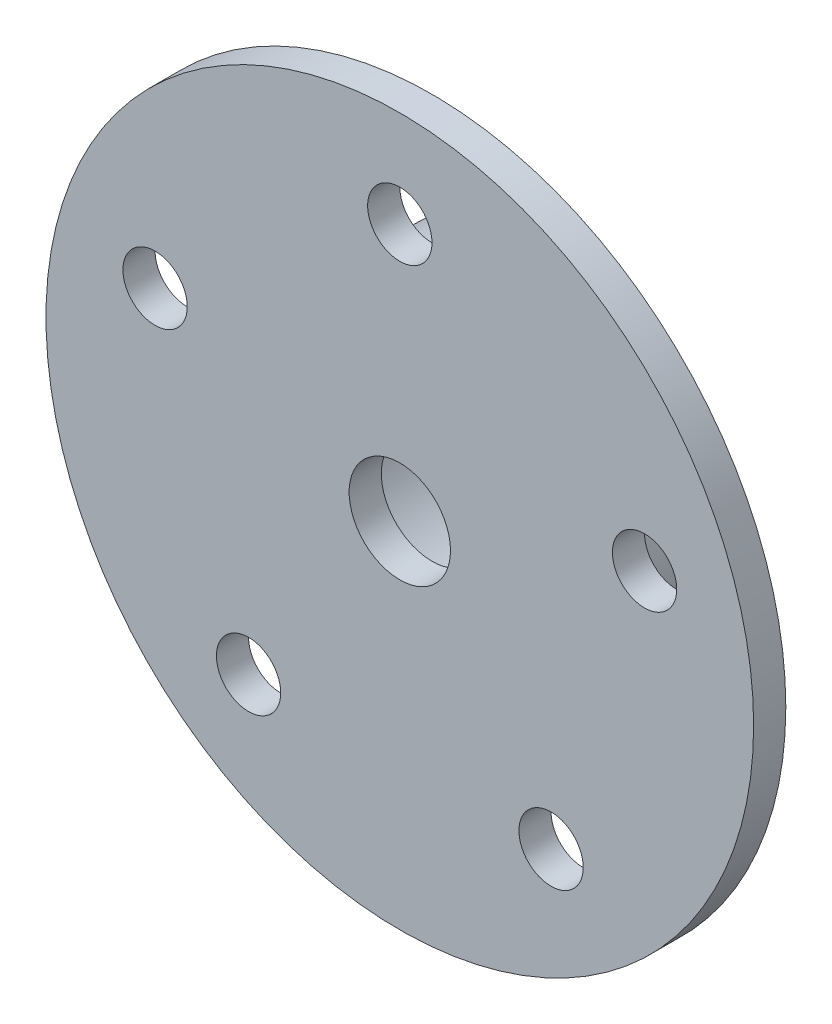
ISO-10303-21;
HEADER;
FILE_DESCRIPTION(('STEP AP214'),'2;1');
FILE_NAME('part.step','',(''),(''),'','','');
FILE_SCHEMA(('AUTOMOTIVE_DESIGN { 1 0 10303 214 1 1 1 1 }'));
ENDSEC;
DATA;
#1=APPLICATION_CONTEXT('core data for automotive mechanical design processes');
#2=APPLICATION_PROTOCOL_DEFINITION('international standard','automotive_design',2000,#1);
#3=PRODUCT_CONTEXT('',#1,'mechanical');
#4=PRODUCT('Part','Part','',(#3));
#5=PRODUCT_RELATED_PRODUCT_CATEGORY('part','',(#4));
#6=PRODUCT_DEFINITION_FORMATION('','',#4);
#7=PRODUCT_DEFINITION_CONTEXT('part definition',#1,'design');
#8=PRODUCT_DEFINITION('design','',#6,#7);
#9=PRODUCT_DEFINITION_SHAPE('','',#8);
#10=(LENGTH_UNIT() NAMED_UNIT(*) SI_UNIT(.MILLI.,.METRE.));
#11=(NAMED_UNIT(*) PLANE_ANGLE_UNIT() SI_UNIT($,.RADIAN.));
#12=(NAMED_UNIT(*) SI_UNIT($,.STERADIAN.) SOLID_ANGLE_UNIT());
#13=UNCERTAINTY_MEASURE_WITH_UNIT(LENGTH_MEASURE(1.E-05),#10,'distance_accuracy_value','');
#14=(GEOMETRIC_REPRESENTATION_CONTEXT(3) GLOBAL_UNCERTAINTY_ASSIGNED_CONTEXT((#13)) GLOBAL_UNIT_ASSIGNED_CONTEXT((#10,
#11,#12)) REPRESENTATION_CONTEXT('',''));
#15=CARTESIAN_POINT('',(0.,0.,0.));
#16=DIRECTION('',(0.,0.,1.));
#17=DIRECTION('',(1.,0.,0.));
#18=AXIS2_PLACEMENT_3D('',#15,#16,#17);
#19=CARTESIAN_POINT('',(0.,0.,0.));
#20=DIRECTION('',(0.,0.,1.));
#21=DIRECTION('',(1.,0.,0.));
#22=AXIS2_PLACEMENT_3D('',#19,#20,#21);
#23=PLANE('',#22);
#24=CARTESIAN_POINT('',(0.,0.,0.));
#25=DIRECTION('',(0.,0.,1.));
#26=DIRECTION('',(1.,0.,0.));
#27=AXIS2_PLACEMENT_3D('',#24,#25,#26);
#28=CIRCLE('',#27,3.15);
#29=CARTESIAN_POINT('',(3.15,0.,0.));
#30=VERTEX_POINT('',#29);
#31=EDGE_CURVE('E63',#30,#30,#28,.T.);
#32=ORIENTED_EDGE('',*,*,#31,.T.);
#33=EDGE_LOOP('',(#32));
#34=FACE_BOUND('',#33,.T.);
#35=CARTESIAN_POINT('',(0.,0.,0.));
#36=DIRECTION('',(0.,0.,-1.));
#37=DIRECTION('',(-1.,0.,0.));
#38=AXIS2_PLACEMENT_3D('',#35,#36,#37);
#39=CIRCLE('',#38,7.6);
#40=CARTESIAN_POINT('',(-7.6,0.,0.));
#41=VERTEX_POINT('',#40);
#42=EDGE_CURVE('E90',#41,#41,#39,.T.);
#43=ORIENTED_EDGE('',*,*,#42,.T.);
#44=EDGE_LOOP('',(#43));
#45=FACE_BOUND('',#44,.T.);
#46=ADVANCED_FACE('F33',(#34,#45),#23,.F.);
#47=CARTESIAN_POINT('',(0.,0.,2.));
#48=DIRECTION('',(0.,0.,1.));
#49=DIRECTION('',(1.,0.,0.));
#50=AXIS2_PLACEMENT_3D('',#47,#48,#49);
#51=PLANE('',#50);
#52=CARTESIAN_POINT('',(-9.40456403667834,-12.9442719099996,2.));
#53=DIRECTION('',(0.,0.,1.));
#54=DIRECTION('',(1.,0.,0.));
#55=AXIS2_PLACEMENT_3D('',#52,#53,#54);
#56=CIRCLE('',#55,2.00000000000142);
#57=CARTESIAN_POINT('',(-7.40456403667692,-12.9442719099996,2.));
#58=VERTEX_POINT('',#57);
#59=EDGE_CURVE('E72',#58,#58,#56,.T.);
#60=ORIENTED_EDGE('',*,*,#59,.F.);
#61=EDGE_LOOP('',(#60));
#62=FACE_BOUND('',#61,.T.);
#63=CARTESIAN_POINT('',(0.,0.,2.));
#64=DIRECTION('',(0.,0.,1.));
#65=DIRECTION('',(1.,0.,0.));
#66=AXIS2_PLACEMENT_3D('',#63,#64,#65);
#67=CIRCLE('',#66,3.15);
#68=CARTESIAN_POINT('',(3.15,0.,2.));
#69=VERTEX_POINT('',#68);
#70=EDGE_CURVE('E60',#69,#69,#67,.T.);
#71=ORIENTED_EDGE('',*,*,#70,.F.);
#72=EDGE_LOOP('',(#71));
#73=FACE_BOUND('',#72,.T.);
#74=CARTESIAN_POINT('',(0.,16.,2.));
#75=DIRECTION('',(0.,0.,1.));
#76=DIRECTION('',(1.,0.,0.));
#77=AXIS2_PLACEMENT_3D('',#74,#75,#76);
#78=CIRCLE('',#77,2.);
#79=CARTESIAN_POINT('',(2.,16.,2.));
#80=VERTEX_POINT('',#79);
#81=EDGE_CURVE('E49',#80,#80,#78,.T.);
#82=ORIENTED_EDGE('',*,*,#81,.F.);
#83=EDGE_LOOP('',(#82));
#84=FACE_BOUND('',#83,.T.);
#85=CARTESIAN_POINT('',(0.,0.,2.));
#86=DIRECTION('',(0.,0.,1.));
#87=DIRECTION('',(1.,0.,0.));
#88=AXIS2_PLACEMENT_3D('',#85,#86,#87);
#89=CIRCLE('',#88,22.);
#90=CARTESIAN_POINT('',(22.,0.,2.));
#91=VERTEX_POINT('',#90);
#92=EDGE_CURVE('E40',#91,#91,#89,.T.);
#93=ORIENTED_EDGE('',*,*,#92,.T.);
#94=EDGE_LOOP('',(#93));
#95=FACE_BOUND('',#94,.T.);
#96=CARTESIAN_POINT('',(15.2169042607229,4.94427190999981,2.));
#97=DIRECTION('',(0.,0.,1.));
#98=DIRECTION('',(1.,0.,0.));
#99=AXIS2_PLACEMENT_3D('',#96,#97,#98);
#100=CIRCLE('',#99,2.00000000000031);
#101=CARTESIAN_POINT('',(17.2169042607232,4.94427190999981,2.));
#102=VERTEX_POINT('',#101);
#103=EDGE_CURVE('E54',#102,#102,#100,.T.);
#104=ORIENTED_EDGE('',*,*,#103,.F.);
#105=EDGE_LOOP('',(#104));
#106=FACE_BOUND('',#105,.T.);
#107=CARTESIAN_POINT('',(9.4045640366808,-12.9442719099988,2.));
#108=DIRECTION('',(0.,0.,1.));
#109=DIRECTION('',(1.,0.,0.));
#110=AXIS2_PLACEMENT_3D('',#107,#108,#109);
#111=CIRCLE('',#110,2.00000000000115);
#112=CARTESIAN_POINT('',(11.4045640366819,-12.9442719099988,2.));
#113=VERTEX_POINT('',#112);
#114=EDGE_CURVE('E66',#113,#113,#111,.T.);
#115=ORIENTED_EDGE('',*,*,#114,.F.);
#116=EDGE_LOOP('',(#115));
#117=FACE_BOUND('',#116,.T.);
#118=CARTESIAN_POINT('',(-15.216904260722,4.94427190999851,2.));
#119=DIRECTION('',(0.,0.,1.));
#120=DIRECTION('',(1.,0.,0.));
#121=AXIS2_PLACEMENT_3D('',#118,#119,#120);
#122=CIRCLE('',#121,2.00000000000081);
#123=CARTESIAN_POINT('',(-13.2169042607212,4.94427190999851,2.));
#124=VERTEX_POINT('',#123);
#125=EDGE_CURVE('E78',#124,#124,#122,.T.);
#126=ORIENTED_EDGE('',*,*,#125,.F.);
#127=EDGE_LOOP('',(#126));
#128=FACE_BOUND('',#127,.T.);
#129=ADVANCED_FACE('F116',(#62,#73,#84,#95,#106,#117,#128),#51,.T.);
#130=CARTESIAN_POINT('',(0.,0.,0.));
#131=DIRECTION('',(0.,0.,1.));
#132=DIRECTION('',(1.,0.,0.));
#133=AXIS2_PLACEMENT_3D('',#130,#131,#132);
#134=CIRCLE('',#133,11.);
#135=CARTESIAN_POINT('',(11.,0.,0.));
#136=VERTEX_POINT('',#135);
#137=EDGE_CURVE('E10',#136,#136,#134,.F.);
#138=ORIENTED_EDGE('',*,*,#137,.F.);
#139=EDGE_LOOP('',(#138));
#140=FACE_BOUND('',#139,.T.);
#141=CARTESIAN_POINT('',(0.,0.,0.));
#142=DIRECTION('',(0.,0.,1.));
#143=DIRECTION('',(1.,0.,0.));
#144=AXIS2_PLACEMENT_3D('',#141,#142,#143);
#145=CIRCLE('',#144,22.);
#146=CARTESIAN_POINT('',(22.,0.,0.));
#147=VERTEX_POINT('',#146);
#148=EDGE_CURVE('E44',#147,#147,#145,.T.);
#149=ORIENTED_EDGE('',*,*,#148,.F.);
#150=EDGE_LOOP('',(#149));
#151=FACE_BOUND('',#150,.T.);
#152=CARTESIAN_POINT('',(0.,16.,0.));
#153=DIRECTION('',(0.,0.,1.));
#154=DIRECTION('',(1.,0.,0.));
#155=AXIS2_PLACEMENT_3D('',#152,#153,#154);
#156=CIRCLE('',#155,2.);
#157=CARTESIAN_POINT('',(2.,16.,0.));
#158=VERTEX_POINT('',#157);
#159=EDGE_CURVE('E51',#158,#158,#156,.T.);
#160=ORIENTED_EDGE('',*,*,#159,.T.);
#161=EDGE_LOOP('',(#160));
#162=FACE_BOUND('',#161,.T.);
#163=CARTESIAN_POINT('',(15.2169042607229,4.94427190999981,0.));
#164=DIRECTION('',(0.,0.,1.));
#165=DIRECTION('',(1.,0.,0.));
#166=AXIS2_PLACEMENT_3D('',#163,#164,#165);
#167=CIRCLE('',#166,2.00000000000031);
#168=CARTESIAN_POINT('',(17.2169042607232,4.94427190999981,0.));
#169=VERTEX_POINT('',#168);
#170=EDGE_CURVE('E57',#169,#169,#167,.T.);
#171=ORIENTED_EDGE('',*,*,#170,.T.);
#172=EDGE_LOOP('',(#171));
#173=FACE_BOUND('',#172,.T.);
#174=CARTESIAN_POINT('',(9.4045640366808,-12.9442719099988,0.));
#175=DIRECTION('',(0.,0.,1.));
#176=DIRECTION('',(1.,0.,0.));
#177=AXIS2_PLACEMENT_3D('',#174,#175,#176);
#178=CIRCLE('',#177,2.00000000000115);
#179=CARTESIAN_POINT('',(11.4045640366819,-12.9442719099988,0.));
#180=VERTEX_POINT('',#179);
#181=EDGE_CURVE('E69',#180,#180,#178,.T.);
#182=ORIENTED_EDGE('',*,*,#181,.T.);
#183=EDGE_LOOP('',(#182));
#184=FACE_BOUND('',#183,.T.);
#185=CARTESIAN_POINT('',(-9.40456403667834,-12.9442719099996,0.));
#186=DIRECTION('',(0.,0.,1.));
#187=DIRECTION('',(1.,0.,0.));
#188=AXIS2_PLACEMENT_3D('',#185,#186,#187);
#189=CIRCLE('',#188,2.00000000000142);
#190=CARTESIAN_POINT('',(-7.40456403667692,-12.9442719099996,0.));
#191=VERTEX_POINT('',#190);
#192=EDGE_CURVE('E75',#191,#191,#189,.T.);
#193=ORIENTED_EDGE('',*,*,#192,.T.);
#194=EDGE_LOOP('',(#193));
#195=FACE_BOUND('',#194,.T.);
#196=CARTESIAN_POINT('',(-15.216904260722,4.94427190999851,0.));
#197=DIRECTION('',(0.,0.,1.));
#198=DIRECTION('',(1.,0.,0.));
#199=AXIS2_PLACEMENT_3D('',#196,#197,#198);
#200=CIRCLE('',#199,2.00000000000081);
#201=CARTESIAN_POINT('',(-13.2169042607212,4.94427190999851,0.));
#202=VERTEX_POINT('',#201);
#203=EDGE_CURVE('E81',#202,#202,#200,.T.);
#204=ORIENTED_EDGE('',*,*,#203,.T.);
#205=EDGE_LOOP('',(#204));
#206=FACE_BOUND('',#205,.T.);
#207=ADVANCED_FACE('F118',(#140,#151,#162,#173,#184,#195,#206),#23,.F.);
#208=CARTESIAN_POINT('',(0.,0.,2.));
#209=DIRECTION('',(0.,0.,-1.));
#210=DIRECTION('',(-1.,0.,0.));
#211=AXIS2_PLACEMENT_3D('',#208,#209,#210);
#212=CYLINDRICAL_SURFACE('',#211,22.);
#213=ORIENTED_EDGE('',*,*,#92,.F.);
#214=EDGE_LOOP('',(#213));
#215=FACE_BOUND('',#214,.T.);
#216=ORIENTED_EDGE('',*,*,#148,.T.);
#217=EDGE_LOOP('',(#216));
#218=FACE_BOUND('',#217,.T.);
#219=ADVANCED_FACE('F35',(#215,#218),#212,.T.);
#220=CARTESIAN_POINT('',(0.,16.,2.));
#221=DIRECTION('',(0.,0.,-1.));
#222=DIRECTION('',(-1.,0.,0.));
#223=AXIS2_PLACEMENT_3D('',#220,#221,#222);
#224=CYLINDRICAL_SURFACE('',#223,2.);
#225=ORIENTED_EDGE('',*,*,#81,.T.);
#226=EDGE_LOOP('',(#225));
#227=FACE_BOUND('',#226,.T.);
#228=ORIENTED_EDGE('',*,*,#159,.F.);
#229=EDGE_LOOP('',(#228));
#230=FACE_BOUND('',#229,.T.);
#231=ADVANCED_FACE('F130',(#227,#230),#224,.F.);
#232=CARTESIAN_POINT('',(15.2169042607229,4.94427190999981,2.));
#233=DIRECTION('',(0.,0.,-1.));
#234=DIRECTION('',(-1.,0.,0.));
#235=AXIS2_PLACEMENT_3D('',#232,#233,#234);
#236=CYLINDRICAL_SURFACE('',#235,2.00000000000031);
#237=ORIENTED_EDGE('',*,*,#103,.T.);
#238=EDGE_LOOP('',(#237));
#239=FACE_BOUND('',#238,.T.);
#240=ORIENTED_EDGE('',*,*,#170,.F.);
#241=EDGE_LOOP('',(#240));
#242=FACE_BOUND('',#241,.T.);
#243=ADVANCED_FACE('F159',(#239,#242),#236,.F.);
#244=CARTESIAN_POINT('',(0.,0.,2.));
#245=DIRECTION('',(0.,0.,-1.));
#246=DIRECTION('',(-1.,0.,0.));
#247=AXIS2_PLACEMENT_3D('',#244,#245,#246);
#248=CYLINDRICAL_SURFACE('',#247,3.15);
#249=ORIENTED_EDGE('',*,*,#70,.T.);
#250=EDGE_LOOP('',(#249));
#251=FACE_BOUND('',#250,.T.);
#252=ORIENTED_EDGE('',*,*,#31,.F.);
#253=EDGE_LOOP('',(#252));
#254=FACE_BOUND('',#253,.T.);
#255=ADVANCED_FACE('F153',(#251,#254),#248,.F.);
#256=CARTESIAN_POINT('',(9.4045640366808,-12.9442719099988,2.));
#257=DIRECTION('',(0.,0.,-1.));
#258=DIRECTION('',(-1.,0.,0.));
#259=AXIS2_PLACEMENT_3D('',#256,#257,#258);
#260=CYLINDRICAL_SURFACE('',#259,2.00000000000115);
#261=ORIENTED_EDGE('',*,*,#114,.T.);
#262=EDGE_LOOP('',(#261));
#263=FACE_BOUND('',#262,.T.);
#264=ORIENTED_EDGE('',*,*,#181,.F.);
#265=EDGE_LOOP('',(#264));
#266=FACE_BOUND('',#265,.T.);
#267=ADVANCED_FACE('F147',(#263,#266),#260,.F.);
#268=CARTESIAN_POINT('',(-9.40456403667834,-12.9442719099996,2.));
#269=DIRECTION('',(0.,0.,-1.));
#270=DIRECTION('',(-1.,0.,0.));
#271=AXIS2_PLACEMENT_3D('',#268,#269,#270);
#272=CYLINDRICAL_SURFACE('',#271,2.00000000000142);
#273=ORIENTED_EDGE('',*,*,#59,.T.);
#274=EDGE_LOOP('',(#273));
#275=FACE_BOUND('',#274,.T.);
#276=ORIENTED_EDGE('',*,*,#192,.F.);
#277=EDGE_LOOP('',(#276));
#278=FACE_BOUND('',#277,.T.);
#279=ADVANCED_FACE('F111',(#275,#278),#272,.F.);
#280=CARTESIAN_POINT('',(-15.216904260722,4.94427190999851,2.));
#281=DIRECTION('',(0.,0.,-1.));
#282=DIRECTION('',(-1.,0.,0.));
#283=AXIS2_PLACEMENT_3D('',#280,#281,#282);
#284=CYLINDRICAL_SURFACE('',#283,2.00000000000081);
#285=ORIENTED_EDGE('',*,*,#125,.T.);
#286=EDGE_LOOP('',(#285));
#287=FACE_BOUND('',#286,.T.);
#288=ORIENTED_EDGE('',*,*,#203,.F.);
#289=EDGE_LOOP('',(#288));
#290=FACE_BOUND('',#289,.T.);
#291=ADVANCED_FACE('F102',(#287,#290),#284,.F.);
#292=CARTESIAN_POINT('',(0.,0.,-7.));
#293=DIRECTION('',(0.,0.,-1.));
#294=DIRECTION('',(-1.,0.,0.));
#295=AXIS2_PLACEMENT_3D('',#292,#293,#294);
#296=PLANE('',#295);
#297=CARTESIAN_POINT('',(0.,0.,-7.));
#298=DIRECTION('',(0.,0.,-1.));
#299=DIRECTION('',(-1.,0.,0.));
#300=AXIS2_PLACEMENT_3D('',#297,#298,#299);
#301=CIRCLE('',#300,11.);
#302=CARTESIAN_POINT('',(-11.,0.,-7.));
#303=VERTEX_POINT('',#302);
#304=EDGE_CURVE('E84',#303,#303,#301,.T.);
#305=ORIENTED_EDGE('',*,*,#304,.T.);
#306=EDGE_LOOP('',(#305));
#307=FACE_BOUND('',#306,.T.);
#308=CARTESIAN_POINT('',(0.,0.,-7.));
#309=DIRECTION('',(0.,0.,-1.));
#310=DIRECTION('',(-1.,0.,0.));
#311=AXIS2_PLACEMENT_3D('',#308,#309,#310);
#312=CIRCLE('',#311,7.6);
#313=CARTESIAN_POINT('',(-7.6,0.,-7.));
#314=VERTEX_POINT('',#313);
#315=EDGE_CURVE('E89',#314,#314,#312,.T.);
#316=ORIENTED_EDGE('',*,*,#315,.F.);
#317=EDGE_LOOP('',(#316));
#318=FACE_BOUND('',#317,.T.);
#319=ADVANCED_FACE('F99',(#307,#318),#296,.T.);
#320=CARTESIAN_POINT('',(0.,0.,-7.));
#321=DIRECTION('',(0.,0.,1.));
#322=DIRECTION('',(1.,0.,0.));
#323=AXIS2_PLACEMENT_3D('',#320,#321,#322);
#324=CYLINDRICAL_SURFACE('',#323,11.);
#325=ORIENTED_EDGE('',*,*,#304,.F.);
#326=EDGE_LOOP('',(#325));
#327=FACE_BOUND('',#326,.T.);
#328=ORIENTED_EDGE('',*,*,#137,.T.);
#329=EDGE_LOOP('',(#328));
#330=FACE_BOUND('',#329,.T.);
#331=ADVANCED_FACE('F101',(#327,#330),#324,.T.);
#332=CARTESIAN_POINT('',(0.,0.,-7.));
#333=DIRECTION('',(0.,0.,1.));
#334=DIRECTION('',(1.,0.,0.));
#335=AXIS2_PLACEMENT_3D('',#332,#333,#334);
#336=CYLINDRICAL_SURFACE('',#335,7.6);
#337=ORIENTED_EDGE('',*,*,#315,.T.);
#338=EDGE_LOOP('',(#337));
#339=FACE_BOUND('',#338,.T.);
#340=ORIENTED_EDGE('',*,*,#42,.F.);
#341=EDGE_LOOP('',(#340));
#342=FACE_BOUND('',#341,.T.);
#343=ADVANCED_FACE('F96',(#339,#342),#336,.F.);
#344=CLOSED_SHELL('',(#46,#129,#207,#219,#231,#243,#255,#267,#279,#291,#319,#331,#343));
#345=MANIFOLD_SOLID_BREP('B2',#344);
#346=ADVANCED_BREP_SHAPE_REPRESENTATION('',(#18,#345),#14);
#347=SHAPE_DEFINITION_REPRESENTATION(#9,#346);
ENDSEC;
END-ISO-10303-21;
